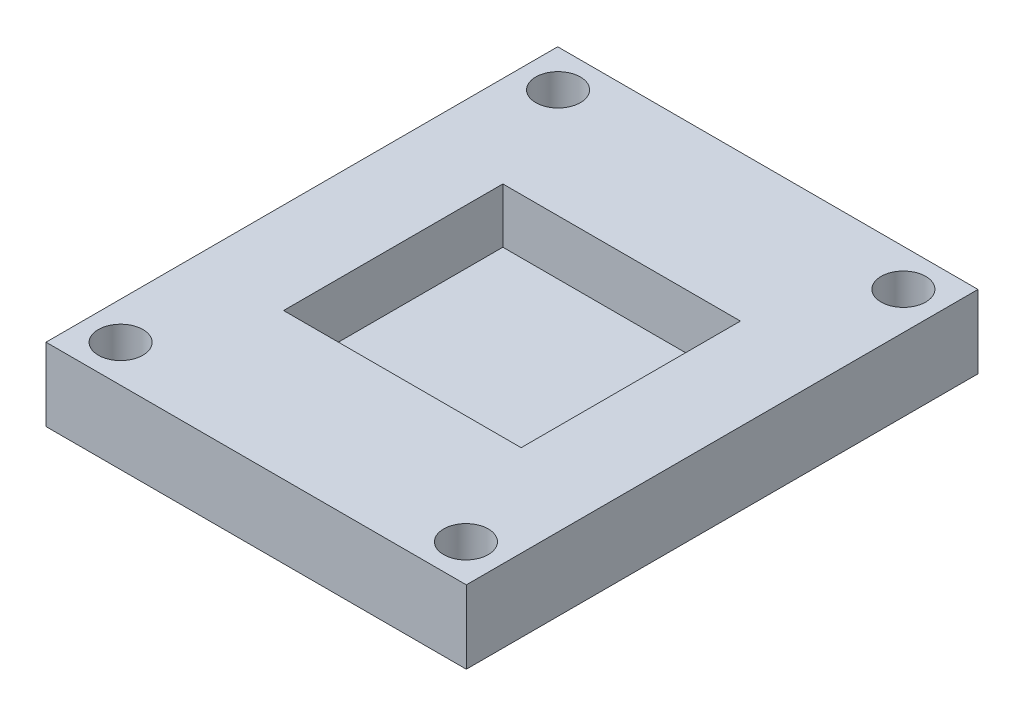
ISO-10303-21;
HEADER;
FILE_DESCRIPTION(('STEP AP214'),'2;1');
FILE_NAME('part.step','',(''),(''),'','','');
FILE_SCHEMA(('AUTOMOTIVE_DESIGN { 1 0 10303 214 1 1 1 1 }'));
ENDSEC;
DATA;
#1=APPLICATION_CONTEXT('core data for automotive mechanical design processes');
#2=APPLICATION_PROTOCOL_DEFINITION('international standard','automotive_design',2000,#1);
#3=PRODUCT_CONTEXT('',#1,'mechanical');
#4=PRODUCT('Part','Part','',(#3));
#5=PRODUCT_RELATED_PRODUCT_CATEGORY('part','',(#4));
#6=PRODUCT_DEFINITION_FORMATION('','',#4);
#7=PRODUCT_DEFINITION_CONTEXT('part definition',#1,'design');
#8=PRODUCT_DEFINITION('design','',#6,#7);
#9=PRODUCT_DEFINITION_SHAPE('','',#8);
#10=(LENGTH_UNIT() NAMED_UNIT(*) SI_UNIT(.MILLI.,.METRE.));
#11=(NAMED_UNIT(*) PLANE_ANGLE_UNIT() SI_UNIT($,.RADIAN.));
#12=(NAMED_UNIT(*) SI_UNIT($,.STERADIAN.) SOLID_ANGLE_UNIT());
#13=UNCERTAINTY_MEASURE_WITH_UNIT(LENGTH_MEASURE(1.E-05),#10,'distance_accuracy_value','');
#14=(GEOMETRIC_REPRESENTATION_CONTEXT(3) GLOBAL_UNCERTAINTY_ASSIGNED_CONTEXT((#13)) GLOBAL_UNIT_ASSIGNED_CONTEXT((#10,
#11,#12)) REPRESENTATION_CONTEXT('',''));
#15=CARTESIAN_POINT('',(0.,0.,0.));
#16=DIRECTION('',(0.,0.,1.));
#17=DIRECTION('',(1.,0.,0.));
#18=AXIS2_PLACEMENT_3D('',#15,#16,#17);
#19=CARTESIAN_POINT('',(0.,5.08,0.));
#20=DIRECTION('',(0.,1.,0.));
#21=DIRECTION('',(0.,0.,1.));
#22=AXIS2_PLACEMENT_3D('',#19,#20,#21);
#23=PLANE('',#22);
#24=DIRECTION('',(0.,0.,1.));
#25=VECTOR('',#24,1.);
#26=CARTESIAN_POINT('',(-6.04370588235293,5.08,-4.11483735294118));
#27=LINE('',#26,#25);
#28=CARTESIAN_POINT('',(-6.04370588235293,5.08,-4.11483735294118));
#29=VERTEX_POINT('',#28);
#30=CARTESIAN_POINT('',(-6.04370588235292,5.08,11.1251626470588));
#31=VERTEX_POINT('',#30);
#32=EDGE_CURVE('E48',#29,#31,#27,.T.);
#33=ORIENTED_EDGE('',*,*,#32,.F.);
#34=DIRECTION('',(-1.,0.,0.));
#35=VECTOR('',#34,1.);
#36=CARTESIAN_POINT('',(-6.04370588235293,5.08,-4.11483735294118));
#37=LINE('',#36,#35);
#38=CARTESIAN_POINT('',(10.4662941176471,5.08,-4.11483735294118));
#39=VERTEX_POINT('',#38);
#40=EDGE_CURVE('E127',#39,#29,#37,.T.);
#41=ORIENTED_EDGE('',*,*,#40,.F.);
#42=DIRECTION('',(0.,0.,-1.));
#43=VECTOR('',#42,1.);
#44=CARTESIAN_POINT('',(10.4662941176471,5.08,-4.11483735294118));
#45=LINE('',#44,#43);
#46=CARTESIAN_POINT('',(10.4662941176471,5.08,11.1251626470588));
#47=VERTEX_POINT('',#46);
#48=EDGE_CURVE('E130',#47,#39,#45,.T.);
#49=ORIENTED_EDGE('',*,*,#48,.F.);
#50=DIRECTION('',(1.,0.,0.));
#51=VECTOR('',#50,1.);
#52=CARTESIAN_POINT('',(-6.04370588235292,5.08,11.1251626470588));
#53=LINE('',#52,#51);
#54=EDGE_CURVE('E136',#31,#47,#53,.T.);
#55=ORIENTED_EDGE('',*,*,#54,.F.);
#56=EDGE_LOOP('',(#33,#41,#49,#55));
#57=FACE_BOUND('',#56,.T.);
#58=CARTESIAN_POINT('',(14.2112955176471,5.08,18.7051576470588));
#59=DIRECTION('',(0.,1.,0.));
#60=DIRECTION('',(0.,0.,1.));
#61=AXIS2_PLACEMENT_3D('',#58,#59,#60);
#62=CIRCLE('',#61,1.5499969);
#63=CARTESIAN_POINT('',(14.2112955176471,5.08,20.2551545470588));
#64=VERTEX_POINT('',#63);
#65=EDGE_CURVE('E152',#64,#64,#62,.T.);
#66=ORIENTED_EDGE('',*,*,#65,.F.);
#67=EDGE_LOOP('',(#66));
#68=FACE_BOUND('',#67,.T.);
#69=CARTESIAN_POINT('',(-9.78870728235293,5.08,-11.6948323529412));
#70=DIRECTION('',(0.,1.,0.));
#71=DIRECTION('',(0.,0.,1.));
#72=AXIS2_PLACEMENT_3D('',#69,#70,#71);
#73=CIRCLE('',#72,1.5499969);
#74=CARTESIAN_POINT('',(-9.78870728235293,5.08,-10.1448354529412));
#75=VERTEX_POINT('',#74);
#76=EDGE_CURVE('E164',#75,#75,#73,.T.);
#77=ORIENTED_EDGE('',*,*,#76,.F.);
#78=EDGE_LOOP('',(#77));
#79=FACE_BOUND('',#78,.T.);
#80=DIRECTION('',(0.,0.,1.));
#81=VECTOR('',#80,1.);
#82=CARTESIAN_POINT('',(-12.3937058823529,5.08,-14.2748373529412));
#83=LINE('',#82,#81);
#84=CARTESIAN_POINT('',(-12.3937058823529,5.08,-14.2748373529412));
#85=VERTEX_POINT('',#84);
#86=CARTESIAN_POINT('',(-12.3937058823529,5.08,21.2851626470588));
#87=VERTEX_POINT('',#86);
#88=EDGE_CURVE('E170',#85,#87,#83,.T.);
#89=ORIENTED_EDGE('',*,*,#88,.T.);
#90=DIRECTION('',(1.,0.,0.));
#91=VECTOR('',#90,1.);
#92=CARTESIAN_POINT('',(-12.3937058823529,5.08,21.2851626470588));
#93=LINE('',#92,#91);
#94=CARTESIAN_POINT('',(16.8162941176471,5.08,21.2851626470588));
#95=VERTEX_POINT('',#94);
#96=EDGE_CURVE('E85',#87,#95,#93,.T.);
#97=ORIENTED_EDGE('',*,*,#96,.T.);
#98=DIRECTION('',(0.,0.,-1.));
#99=VECTOR('',#98,1.);
#100=CARTESIAN_POINT('',(16.8162941176471,5.08,-14.2748373529412));
#101=LINE('',#100,#99);
#102=CARTESIAN_POINT('',(16.8162941176471,5.08,-14.2748373529412));
#103=VERTEX_POINT('',#102);
#104=EDGE_CURVE('E173',#95,#103,#101,.T.);
#105=ORIENTED_EDGE('',*,*,#104,.T.);
#106=DIRECTION('',(-1.,0.,0.));
#107=VECTOR('',#106,1.);
#108=CARTESIAN_POINT('',(-12.3937058823529,5.08,-14.2748373529412));
#109=LINE('',#108,#107);
#110=EDGE_CURVE('E57',#103,#85,#109,.T.);
#111=ORIENTED_EDGE('',*,*,#110,.T.);
#112=EDGE_LOOP('',(#89,#97,#105,#111));
#113=FACE_BOUND('',#112,.T.);
#114=CARTESIAN_POINT('',(14.2112955176471,5.08,-11.6948323529412));
#115=DIRECTION('',(0.,1.,0.));
#116=DIRECTION('',(0.,0.,1.));
#117=AXIS2_PLACEMENT_3D('',#114,#115,#116);
#118=CIRCLE('',#117,1.5499969);
#119=CARTESIAN_POINT('',(14.2112955176471,5.08,-10.1448354529412));
#120=VERTEX_POINT('',#119);
#121=EDGE_CURVE('E158',#120,#120,#118,.T.);
#122=ORIENTED_EDGE('',*,*,#121,.F.);
#123=EDGE_LOOP('',(#122));
#124=FACE_BOUND('',#123,.T.);
#125=CARTESIAN_POINT('',(-9.78870728235293,5.08,18.7051576470588));
#126=DIRECTION('',(0.,1.,0.));
#127=DIRECTION('',(0.,0.,1.));
#128=AXIS2_PLACEMENT_3D('',#125,#126,#127);
#129=CIRCLE('',#128,1.5499969);
#130=CARTESIAN_POINT('',(-9.78870728235293,5.08,20.2551545470588));
#131=VERTEX_POINT('',#130);
#132=EDGE_CURVE('E146',#131,#131,#129,.T.);
#133=ORIENTED_EDGE('',*,*,#132,.F.);
#134=EDGE_LOOP('',(#133));
#135=FACE_BOUND('',#134,.T.);
#136=ADVANCED_FACE('F33',(#57,#68,#79,#113,#124,#135),#23,.T.);
#137=CARTESIAN_POINT('',(0.,0.,0.));
#138=DIRECTION('',(0.,1.,0.));
#139=DIRECTION('',(0.,0.,1.));
#140=AXIS2_PLACEMENT_3D('',#137,#138,#139);
#141=PLANE('',#140);
#142=DIRECTION('',(0.,0.,1.));
#143=VECTOR('',#142,1.);
#144=CARTESIAN_POINT('',(-12.3937058823529,0.,-14.2748373529412));
#145=LINE('',#144,#143);
#146=CARTESIAN_POINT('',(-12.3937058823529,0.,-14.2748373529412));
#147=VERTEX_POINT('',#146);
#148=CARTESIAN_POINT('',(-12.3937058823529,0.,21.2851626470588));
#149=VERTEX_POINT('',#148);
#150=EDGE_CURVE('E167',#147,#149,#145,.T.);
#151=ORIENTED_EDGE('',*,*,#150,.F.);
#152=DIRECTION('',(-1.,0.,0.));
#153=VECTOR('',#152,1.);
#154=CARTESIAN_POINT('',(-12.3937058823529,0.,-14.2748373529412));
#155=LINE('',#154,#153);
#156=CARTESIAN_POINT('',(16.8162941176471,0.,-14.2748373529412));
#157=VERTEX_POINT('',#156);
#158=EDGE_CURVE('E78',#157,#147,#155,.T.);
#159=ORIENTED_EDGE('',*,*,#158,.F.);
#160=DIRECTION('',(0.,0.,-1.));
#161=VECTOR('',#160,1.);
#162=CARTESIAN_POINT('',(16.8162941176471,0.,-14.2748373529412));
#163=LINE('',#162,#161);
#164=CARTESIAN_POINT('',(16.8162941176471,0.,21.2851626470588));
#165=VERTEX_POINT('',#164);
#166=EDGE_CURVE('E181',#165,#157,#163,.T.);
#167=ORIENTED_EDGE('',*,*,#166,.F.);
#168=DIRECTION('',(1.,0.,0.));
#169=VECTOR('',#168,1.);
#170=CARTESIAN_POINT('',(-12.3937058823529,0.,21.2851626470588));
#171=LINE('',#170,#169);
#172=EDGE_CURVE('E179',#149,#165,#171,.T.);
#173=ORIENTED_EDGE('',*,*,#172,.F.);
#174=EDGE_LOOP('',(#151,#159,#167,#173));
#175=FACE_BOUND('',#174,.T.);
#176=CARTESIAN_POINT('',(-9.78870728235293,0.,-11.6948323529412));
#177=DIRECTION('',(0.,1.,0.));
#178=DIRECTION('',(0.,0.,1.));
#179=AXIS2_PLACEMENT_3D('',#176,#177,#178);
#180=CIRCLE('',#179,1.5499969);
#181=CARTESIAN_POINT('',(-9.78870728235293,0.,-10.1448354529412));
#182=VERTEX_POINT('',#181);
#183=EDGE_CURVE('E161',#182,#182,#180,.T.);
#184=ORIENTED_EDGE('',*,*,#183,.T.);
#185=EDGE_LOOP('',(#184));
#186=FACE_BOUND('',#185,.T.);
#187=CARTESIAN_POINT('',(14.2112955176471,0.,-11.6948323529412));
#188=DIRECTION('',(0.,1.,0.));
#189=DIRECTION('',(0.,0.,1.));
#190=AXIS2_PLACEMENT_3D('',#187,#188,#189);
#191=CIRCLE('',#190,1.5499969);
#192=CARTESIAN_POINT('',(14.2112955176471,0.,-10.1448354529412));
#193=VERTEX_POINT('',#192);
#194=EDGE_CURVE('E155',#193,#193,#191,.T.);
#195=ORIENTED_EDGE('',*,*,#194,.T.);
#196=EDGE_LOOP('',(#195));
#197=FACE_BOUND('',#196,.T.);
#198=CARTESIAN_POINT('',(14.2112955176471,0.,18.7051576470588));
#199=DIRECTION('',(0.,1.,0.));
#200=DIRECTION('',(0.,0.,1.));
#201=AXIS2_PLACEMENT_3D('',#198,#199,#200);
#202=CIRCLE('',#201,1.5499969);
#203=CARTESIAN_POINT('',(14.2112955176471,0.,20.2551545470588));
#204=VERTEX_POINT('',#203);
#205=EDGE_CURVE('E149',#204,#204,#202,.T.);
#206=ORIENTED_EDGE('',*,*,#205,.T.);
#207=EDGE_LOOP('',(#206));
#208=FACE_BOUND('',#207,.T.);
#209=CARTESIAN_POINT('',(-9.78870728235293,0.,18.7051576470588));
#210=DIRECTION('',(0.,1.,0.));
#211=DIRECTION('',(0.,0.,1.));
#212=AXIS2_PLACEMENT_3D('',#209,#210,#211);
#213=CIRCLE('',#212,1.5499969);
#214=CARTESIAN_POINT('',(-9.78870728235293,0.,20.2551545470588));
#215=VERTEX_POINT('',#214);
#216=EDGE_CURVE('E142',#215,#215,#213,.T.);
#217=ORIENTED_EDGE('',*,*,#216,.T.);
#218=EDGE_LOOP('',(#217));
#219=FACE_BOUND('',#218,.T.);
#220=ADVANCED_FACE('F194',(#175,#186,#197,#208,#219),#141,.F.);
#221=CARTESIAN_POINT('',(-12.3937058823529,5.08,-14.2748373529412));
#222=DIRECTION('',(1.,0.,0.));
#223=DIRECTION('',(0.,0.,-1.));
#224=AXIS2_PLACEMENT_3D('',#221,#222,#223);
#225=PLANE('',#224);
#226=ORIENTED_EDGE('',*,*,#150,.T.);
#227=DIRECTION('',(0.,-1.,0.));
#228=VECTOR('',#227,1.);
#229=CARTESIAN_POINT('',(-12.3937058823529,5.08,21.2851626470588));
#230=LINE('',#229,#228);
#231=EDGE_CURVE('E11',#87,#149,#230,.T.);
#232=ORIENTED_EDGE('',*,*,#231,.F.);
#233=ORIENTED_EDGE('',*,*,#88,.F.);
#234=DIRECTION('',(0.,-1.,0.));
#235=VECTOR('',#234,1.);
#236=CARTESIAN_POINT('',(-12.3937058823529,5.08,-14.2748373529412));
#237=LINE('',#236,#235);
#238=EDGE_CURVE('E176',#85,#147,#237,.T.);
#239=ORIENTED_EDGE('',*,*,#238,.T.);
#240=EDGE_LOOP('',(#226,#232,#233,#239));
#241=FACE_BOUND('',#240,.T.);
#242=ADVANCED_FACE('F35',(#241),#225,.F.);
#243=CARTESIAN_POINT('',(-12.3937058823529,5.08,21.2851626470588));
#244=DIRECTION('',(0.,0.,-1.));
#245=DIRECTION('',(-1.,0.,0.));
#246=AXIS2_PLACEMENT_3D('',#243,#244,#245);
#247=PLANE('',#246);
#248=ORIENTED_EDGE('',*,*,#172,.T.);
#249=DIRECTION('',(0.,-1.,0.));
#250=VECTOR('',#249,1.);
#251=CARTESIAN_POINT('',(16.8162941176471,5.08,21.2851626470588));
#252=LINE('',#251,#250);
#253=EDGE_CURVE('E41',#95,#165,#252,.T.);
#254=ORIENTED_EDGE('',*,*,#253,.F.);
#255=ORIENTED_EDGE('',*,*,#96,.F.);
#256=ORIENTED_EDGE('',*,*,#231,.T.);
#257=EDGE_LOOP('',(#248,#254,#255,#256));
#258=FACE_BOUND('',#257,.T.);
#259=ADVANCED_FACE('F210',(#258),#247,.F.);
#260=CARTESIAN_POINT('',(16.8162941176471,5.08,-14.2748373529412));
#261=DIRECTION('',(-1.,0.,0.));
#262=DIRECTION('',(0.,0.,1.));
#263=AXIS2_PLACEMENT_3D('',#260,#261,#262);
#264=PLANE('',#263);
#265=ORIENTED_EDGE('',*,*,#166,.T.);
#266=DIRECTION('',(0.,-1.,0.));
#267=VECTOR('',#266,1.);
#268=CARTESIAN_POINT('',(16.8162941176471,5.08,-14.2748373529412));
#269=LINE('',#268,#267);
#270=EDGE_CURVE('E185',#103,#157,#269,.T.);
#271=ORIENTED_EDGE('',*,*,#270,.F.);
#272=ORIENTED_EDGE('',*,*,#104,.F.);
#273=ORIENTED_EDGE('',*,*,#253,.T.);
#274=EDGE_LOOP('',(#265,#271,#272,#273));
#275=FACE_BOUND('',#274,.T.);
#276=ADVANCED_FACE('F190',(#275),#264,.F.);
#277=CARTESIAN_POINT('',(-12.3937058823529,5.08,-14.2748373529412));
#278=DIRECTION('',(0.,0.,1.));
#279=DIRECTION('',(1.,0.,0.));
#280=AXIS2_PLACEMENT_3D('',#277,#278,#279);
#281=PLANE('',#280);
#282=ORIENTED_EDGE('',*,*,#158,.T.);
#283=ORIENTED_EDGE('',*,*,#238,.F.);
#284=ORIENTED_EDGE('',*,*,#110,.F.);
#285=ORIENTED_EDGE('',*,*,#270,.T.);
#286=EDGE_LOOP('',(#282,#283,#284,#285));
#287=FACE_BOUND('',#286,.T.);
#288=ADVANCED_FACE('F199',(#287),#281,.F.);
#289=CARTESIAN_POINT('',(-9.78870728235293,5.08,-11.6948323529412));
#290=DIRECTION('',(0.,-1.,0.));
#291=DIRECTION('',(0.,0.,-1.));
#292=AXIS2_PLACEMENT_3D('',#289,#290,#291);
#293=CYLINDRICAL_SURFACE('',#292,1.5499969);
#294=ORIENTED_EDGE('',*,*,#76,.T.);
#295=EDGE_LOOP('',(#294));
#296=FACE_BOUND('',#295,.T.);
#297=ORIENTED_EDGE('',*,*,#183,.F.);
#298=EDGE_LOOP('',(#297));
#299=FACE_BOUND('',#298,.T.);
#300=ADVANCED_FACE('F201',(#296,#299),#293,.F.);
#301=CARTESIAN_POINT('',(14.2112955176471,5.08,-11.6948323529412));
#302=DIRECTION('',(0.,-1.,0.));
#303=DIRECTION('',(0.,0.,-1.));
#304=AXIS2_PLACEMENT_3D('',#301,#302,#303);
#305=CYLINDRICAL_SURFACE('',#304,1.5499969);
#306=ORIENTED_EDGE('',*,*,#121,.T.);
#307=EDGE_LOOP('',(#306));
#308=FACE_BOUND('',#307,.T.);
#309=ORIENTED_EDGE('',*,*,#194,.F.);
#310=EDGE_LOOP('',(#309));
#311=FACE_BOUND('',#310,.T.);
#312=ADVANCED_FACE('F207',(#308,#311),#305,.F.);
#313=CARTESIAN_POINT('',(14.2112955176471,5.08,18.7051576470588));
#314=DIRECTION('',(0.,-1.,0.));
#315=DIRECTION('',(0.,0.,-1.));
#316=AXIS2_PLACEMENT_3D('',#313,#314,#315);
#317=CYLINDRICAL_SURFACE('',#316,1.5499969);
#318=ORIENTED_EDGE('',*,*,#65,.T.);
#319=EDGE_LOOP('',(#318));
#320=FACE_BOUND('',#319,.T.);
#321=ORIENTED_EDGE('',*,*,#205,.F.);
#322=EDGE_LOOP('',(#321));
#323=FACE_BOUND('',#322,.T.);
#324=ADVANCED_FACE('F223',(#320,#323),#317,.F.);
#325=CARTESIAN_POINT('',(-9.78870728235293,5.08,18.7051576470588));
#326=DIRECTION('',(0.,-1.,0.));
#327=DIRECTION('',(0.,0.,-1.));
#328=AXIS2_PLACEMENT_3D('',#325,#326,#327);
#329=CYLINDRICAL_SURFACE('',#328,1.5499969);
#330=ORIENTED_EDGE('',*,*,#132,.T.);
#331=EDGE_LOOP('',(#330));
#332=FACE_BOUND('',#331,.T.);
#333=ORIENTED_EDGE('',*,*,#216,.F.);
#334=EDGE_LOOP('',(#333));
#335=FACE_BOUND('',#334,.T.);
#336=ADVANCED_FACE('F227',(#332,#335),#329,.F.);
#337=CARTESIAN_POINT('',(-6.04370588235293,1.27,-4.11483735294118));
#338=DIRECTION('',(-1.,0.,0.));
#339=DIRECTION('',(0.,0.,1.));
#340=AXIS2_PLACEMENT_3D('',#337,#338,#339);
#341=PLANE('',#340);
#342=ORIENTED_EDGE('',*,*,#32,.T.);
#343=DIRECTION('',(0.,1.,0.));
#344=VECTOR('',#343,1.);
#345=CARTESIAN_POINT('',(-6.04370588235292,1.27,11.1251626470588));
#346=LINE('',#345,#344);
#347=CARTESIAN_POINT('',(-6.04370588235292,1.27,11.1251626470588));
#348=VERTEX_POINT('',#347);
#349=EDGE_CURVE('E105',#348,#31,#346,.T.);
#350=ORIENTED_EDGE('',*,*,#349,.F.);
#351=DIRECTION('',(0.,0.,1.));
#352=VECTOR('',#351,1.);
#353=CARTESIAN_POINT('',(-6.04370588235293,1.27,-4.11483735294118));
#354=LINE('',#353,#352);
#355=CARTESIAN_POINT('',(-6.04370588235293,1.27,-4.11483735294118));
#356=VERTEX_POINT('',#355);
#357=EDGE_CURVE('E109',#356,#348,#354,.T.);
#358=ORIENTED_EDGE('',*,*,#357,.F.);
#359=DIRECTION('',(0.,1.,0.));
#360=VECTOR('',#359,1.);
#361=CARTESIAN_POINT('',(-6.04370588235293,1.27,-4.11483735294118));
#362=LINE('',#361,#360);
#363=EDGE_CURVE('E140',#356,#29,#362,.T.);
#364=ORIENTED_EDGE('',*,*,#363,.T.);
#365=EDGE_LOOP('',(#342,#350,#358,#364));
#366=FACE_BOUND('',#365,.T.);
#367=ADVANCED_FACE('F107',(#366),#341,.F.);
#368=CARTESIAN_POINT('',(-6.04370588235293,1.27,-4.11483735294118));
#369=DIRECTION('',(0.,0.,-1.));
#370=DIRECTION('',(-1.,0.,0.));
#371=AXIS2_PLACEMENT_3D('',#368,#369,#370);
#372=PLANE('',#371);
#373=ORIENTED_EDGE('',*,*,#40,.T.);
#374=ORIENTED_EDGE('',*,*,#363,.F.);
#375=DIRECTION('',(-1.,0.,0.));
#376=VECTOR('',#375,1.);
#377=CARTESIAN_POINT('',(-6.04370588235293,1.27,-4.11483735294118));
#378=LINE('',#377,#376);
#379=CARTESIAN_POINT('',(10.4662941176471,1.27,-4.11483735294118));
#380=VERTEX_POINT('',#379);
#381=EDGE_CURVE('E115',#380,#356,#378,.T.);
#382=ORIENTED_EDGE('',*,*,#381,.F.);
#383=DIRECTION('',(0.,1.,0.));
#384=VECTOR('',#383,1.);
#385=CARTESIAN_POINT('',(10.4662941176471,1.27,-4.11483735294118));
#386=LINE('',#385,#384);
#387=EDGE_CURVE('E143',#380,#39,#386,.T.);
#388=ORIENTED_EDGE('',*,*,#387,.T.);
#389=EDGE_LOOP('',(#373,#374,#382,#388));
#390=FACE_BOUND('',#389,.T.);
#391=ADVANCED_FACE('F234',(#390),#372,.F.);
#392=CARTESIAN_POINT('',(10.4662941176471,1.27,-4.11483735294118));
#393=DIRECTION('',(1.,0.,0.));
#394=DIRECTION('',(0.,0.,-1.));
#395=AXIS2_PLACEMENT_3D('',#392,#393,#394);
#396=PLANE('',#395);
#397=ORIENTED_EDGE('',*,*,#48,.T.);
#398=ORIENTED_EDGE('',*,*,#387,.F.);
#399=DIRECTION('',(0.,0.,-1.));
#400=VECTOR('',#399,1.);
#401=CARTESIAN_POINT('',(10.4662941176471,1.27,-4.11483735294118));
#402=LINE('',#401,#400);
#403=CARTESIAN_POINT('',(10.4662941176471,1.27,11.1251626470588));
#404=VERTEX_POINT('',#403);
#405=EDGE_CURVE('E123',#404,#380,#402,.T.);
#406=ORIENTED_EDGE('',*,*,#405,.F.);
#407=DIRECTION('',(0.,1.,0.));
#408=VECTOR('',#407,1.);
#409=CARTESIAN_POINT('',(10.4662941176471,1.27,11.1251626470588));
#410=LINE('',#409,#408);
#411=EDGE_CURVE('E114',#404,#47,#410,.T.);
#412=ORIENTED_EDGE('',*,*,#411,.T.);
#413=EDGE_LOOP('',(#397,#398,#406,#412));
#414=FACE_BOUND('',#413,.T.);
#415=ADVANCED_FACE('F237',(#414),#396,.F.);
#416=CARTESIAN_POINT('',(-6.04370588235292,1.27,11.1251626470588));
#417=DIRECTION('',(0.,0.,1.));
#418=DIRECTION('',(1.,0.,0.));
#419=AXIS2_PLACEMENT_3D('',#416,#417,#418);
#420=PLANE('',#419);
#421=ORIENTED_EDGE('',*,*,#54,.T.);
#422=ORIENTED_EDGE('',*,*,#411,.F.);
#423=DIRECTION('',(1.,0.,0.));
#424=VECTOR('',#423,1.);
#425=CARTESIAN_POINT('',(-6.04370588235292,1.27,11.1251626470588));
#426=LINE('',#425,#424);
#427=EDGE_CURVE('E118',#348,#404,#426,.T.);
#428=ORIENTED_EDGE('',*,*,#427,.F.);
#429=ORIENTED_EDGE('',*,*,#349,.T.);
#430=EDGE_LOOP('',(#421,#422,#428,#429));
#431=FACE_BOUND('',#430,.T.);
#432=ADVANCED_FACE('F119',(#431),#420,.F.);
#433=CARTESIAN_POINT('',(0.,1.27,0.));
#434=DIRECTION('',(0.,1.,0.));
#435=DIRECTION('',(0.,0.,1.));
#436=AXIS2_PLACEMENT_3D('',#433,#434,#435);
#437=PLANE('',#436);
#438=ORIENTED_EDGE('',*,*,#357,.T.);
#439=ORIENTED_EDGE('',*,*,#427,.T.);
#440=ORIENTED_EDGE('',*,*,#405,.T.);
#441=ORIENTED_EDGE('',*,*,#381,.T.);
#442=EDGE_LOOP('',(#438,#439,#440,#441));
#443=FACE_BOUND('',#442,.T.);
#444=ADVANCED_FACE('F125',(#443),#437,.T.);
#445=CLOSED_SHELL('',(#136,#220,#242,#259,#276,#288,#300,#312,#324,#336,#367,#391,#415,#432,#444));
#446=MANIFOLD_SOLID_BREP('B2',#445);
#447=ADVANCED_BREP_SHAPE_REPRESENTATION('',(#18,#446),#14);
#448=SHAPE_DEFINITION_REPRESENTATION(#9,#447);
ENDSEC;
END-ISO-10303-21;
